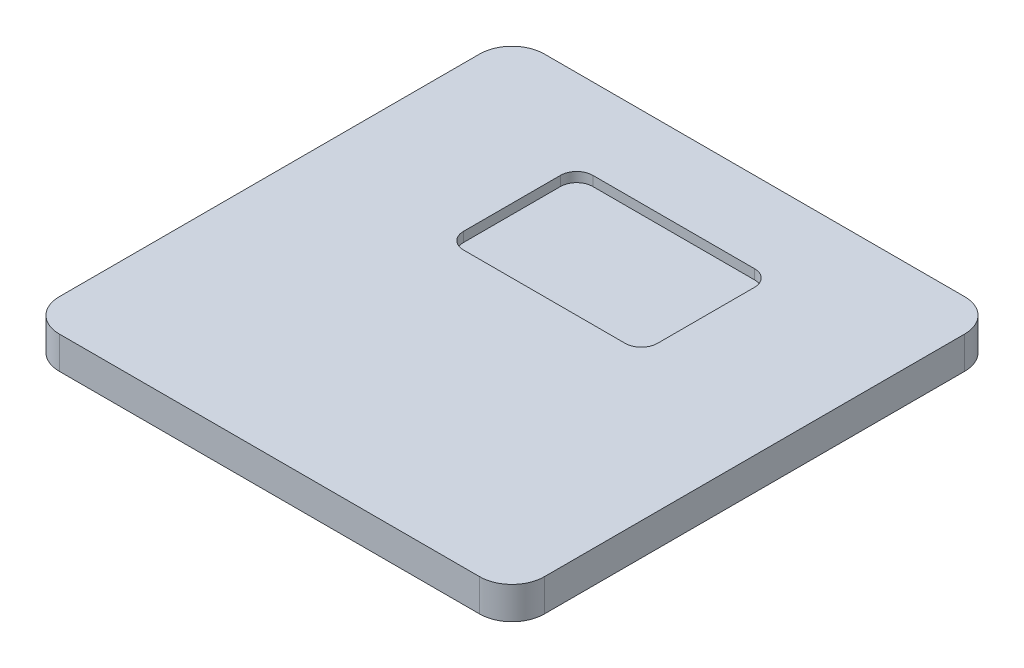
ISO-10303-21;
HEADER;
FILE_DESCRIPTION(('STEP AP214'),'2;1');
FILE_NAME('part.step','',(''),(''),'','','');
FILE_SCHEMA(('AUTOMOTIVE_DESIGN { 1 0 10303 214 1 1 1 1 }'));
ENDSEC;
DATA;
#1=APPLICATION_CONTEXT('core data for automotive mechanical design processes');
#2=APPLICATION_PROTOCOL_DEFINITION('international standard','automotive_design',2000,#1);
#3=PRODUCT_CONTEXT('',#1,'mechanical');
#4=PRODUCT('Part','Part','',(#3));
#5=PRODUCT_RELATED_PRODUCT_CATEGORY('part','',(#4));
#6=PRODUCT_DEFINITION_FORMATION('','',#4);
#7=PRODUCT_DEFINITION_CONTEXT('part definition',#1,'design');
#8=PRODUCT_DEFINITION('design','',#6,#7);
#9=PRODUCT_DEFINITION_SHAPE('','',#8);
#10=(LENGTH_UNIT() NAMED_UNIT(*) SI_UNIT(.MILLI.,.METRE.));
#11=(NAMED_UNIT(*) PLANE_ANGLE_UNIT() SI_UNIT($,.RADIAN.));
#12=(NAMED_UNIT(*) SI_UNIT($,.STERADIAN.) SOLID_ANGLE_UNIT());
#13=UNCERTAINTY_MEASURE_WITH_UNIT(LENGTH_MEASURE(1.E-05),#10,'distance_accuracy_value','');
#14=(GEOMETRIC_REPRESENTATION_CONTEXT(3) GLOBAL_UNCERTAINTY_ASSIGNED_CONTEXT((#13)) GLOBAL_UNIT_ASSIGNED_CONTEXT((#10,
#11,#12)) REPRESENTATION_CONTEXT('',''));
#15=CARTESIAN_POINT('',(0.,0.,0.));
#16=DIRECTION('',(0.,0.,1.));
#17=DIRECTION('',(1.,0.,0.));
#18=AXIS2_PLACEMENT_3D('',#15,#16,#17);
#19=CARTESIAN_POINT('',(25.0000000000001,7.,-15.));
#20=DIRECTION('',(0.,1.,0.));
#21=DIRECTION('',(0.,0.,1.));
#22=AXIS2_PLACEMENT_3D('',#19,#20,#21);
#23=CYLINDRICAL_SURFACE('',#22,5.);
#24=DIRECTION('',(0.,1.,0.));
#25=VECTOR('',#24,1.);
#26=CARTESIAN_POINT('',(30.0000000000001,7.,-15.));
#27=LINE('',#26,#25);
#28=CARTESIAN_POINT('',(30.0000000000001,7.,-15.));
#29=VERTEX_POINT('',#28);
#30=CARTESIAN_POINT('',(30.0000000000001,10.,-15.));
#31=VERTEX_POINT('',#30);
#32=EDGE_CURVE('E281',#29,#31,#27,.T.);
#33=ORIENTED_EDGE('',*,*,#32,.F.);
#34=CARTESIAN_POINT('',(25.0000000000001,7.,-15.));
#35=DIRECTION('',(0.,1.,0.));
#36=DIRECTION('',(0.,0.,1.));
#37=AXIS2_PLACEMENT_3D('',#34,#35,#36);
#38=CIRCLE('',#37,5.);
#39=CARTESIAN_POINT('',(25.0000000000001,7.,-9.99999999999997));
#40=VERTEX_POINT('',#39);
#41=EDGE_CURVE('E51',#40,#29,#38,.T.);
#42=ORIENTED_EDGE('',*,*,#41,.F.);
#43=DIRECTION('',(0.,1.,0.));
#44=VECTOR('',#43,1.);
#45=CARTESIAN_POINT('',(25.0000000000001,7.,-9.99999999999997));
#46=LINE('',#45,#44);
#47=CARTESIAN_POINT('',(25.0000000000001,10.,-9.99999999999997));
#48=VERTEX_POINT('',#47);
#49=EDGE_CURVE('E285',#48,#40,#46,.F.);
#50=ORIENTED_EDGE('',*,*,#49,.F.);
#51=CARTESIAN_POINT('',(25.0000000000001,10.,-15.));
#52=DIRECTION('',(0.,1.,0.));
#53=DIRECTION('',(0.,0.,1.));
#54=AXIS2_PLACEMENT_3D('',#51,#52,#53);
#55=CIRCLE('',#54,5.);
#56=EDGE_CURVE('E11',#48,#31,#55,.T.);
#57=ORIENTED_EDGE('',*,*,#56,.T.);
#58=EDGE_LOOP('',(#33,#42,#50,#57));
#59=FACE_BOUND('',#58,.T.);
#60=ADVANCED_FACE('F43',(#59),#23,.F.);
#61=CARTESIAN_POINT('',(25.,7.,-45.));
#62=DIRECTION('',(0.,-1.,0.));
#63=DIRECTION('',(0.,0.,-1.));
#64=AXIS2_PLACEMENT_3D('',#61,#62,#63);
#65=CYLINDRICAL_SURFACE('',#64,5.);
#66=DIRECTION('',(0.,1.,0.));
#67=VECTOR('',#66,1.);
#68=CARTESIAN_POINT('',(25.,7.,-50.));
#69=LINE('',#68,#67);
#70=CARTESIAN_POINT('',(25.,7.,-50.));
#71=VERTEX_POINT('',#70);
#72=CARTESIAN_POINT('',(25.,10.,-50.));
#73=VERTEX_POINT('',#72);
#74=EDGE_CURVE('E267',#71,#73,#69,.T.);
#75=ORIENTED_EDGE('',*,*,#74,.F.);
#76=CARTESIAN_POINT('',(25.,7.,-45.));
#77=DIRECTION('',(0.,1.,0.));
#78=DIRECTION('',(0.,0.,1.));
#79=AXIS2_PLACEMENT_3D('',#76,#77,#78);
#80=CIRCLE('',#79,5.);
#81=CARTESIAN_POINT('',(30.0000000000001,7.,-45.));
#82=VERTEX_POINT('',#81);
#83=EDGE_CURVE('E275',#82,#71,#80,.T.);
#84=ORIENTED_EDGE('',*,*,#83,.F.);
#85=DIRECTION('',(0.,1.,0.));
#86=VECTOR('',#85,1.);
#87=CARTESIAN_POINT('',(30.0000000000001,7.,-45.));
#88=LINE('',#87,#86);
#89=CARTESIAN_POINT('',(30.0000000000001,10.,-45.));
#90=VERTEX_POINT('',#89);
#91=EDGE_CURVE('E271',#90,#82,#88,.F.);
#92=ORIENTED_EDGE('',*,*,#91,.F.);
#93=CARTESIAN_POINT('',(25.,10.,-45.));
#94=DIRECTION('',(0.,1.,0.));
#95=DIRECTION('',(0.,0.,1.));
#96=AXIS2_PLACEMENT_3D('',#93,#94,#95);
#97=CIRCLE('',#96,5.);
#98=EDGE_CURVE('E278',#90,#73,#97,.T.);
#99=ORIENTED_EDGE('',*,*,#98,.T.);
#100=EDGE_LOOP('',(#75,#84,#92,#99));
#101=FACE_BOUND('',#100,.T.);
#102=ADVANCED_FACE('F373',(#101),#65,.F.);
#103=CARTESIAN_POINT('',(-24.9999999999999,7.,-45.));
#104=DIRECTION('',(0.,1.,0.));
#105=DIRECTION('',(0.,0.,1.));
#106=AXIS2_PLACEMENT_3D('',#103,#104,#105);
#107=CYLINDRICAL_SURFACE('',#106,5.);
#108=DIRECTION('',(0.,1.,0.));
#109=VECTOR('',#108,1.);
#110=CARTESIAN_POINT('',(-29.9999999999999,7.,-45.));
#111=LINE('',#110,#109);
#112=CARTESIAN_POINT('',(-29.9999999999999,7.,-45.));
#113=VERTEX_POINT('',#112);
#114=CARTESIAN_POINT('',(-29.9999999999999,10.,-45.));
#115=VERTEX_POINT('',#114);
#116=EDGE_CURVE('E253',#113,#115,#111,.T.);
#117=ORIENTED_EDGE('',*,*,#116,.F.);
#118=CARTESIAN_POINT('',(-24.9999999999999,7.,-45.));
#119=DIRECTION('',(0.,1.,0.));
#120=DIRECTION('',(0.,0.,1.));
#121=AXIS2_PLACEMENT_3D('',#118,#119,#120);
#122=CIRCLE('',#121,5.);
#123=CARTESIAN_POINT('',(-24.9999999999999,7.,-50.));
#124=VERTEX_POINT('',#123);
#125=EDGE_CURVE('E261',#124,#113,#122,.T.);
#126=ORIENTED_EDGE('',*,*,#125,.F.);
#127=DIRECTION('',(0.,1.,0.));
#128=VECTOR('',#127,1.);
#129=CARTESIAN_POINT('',(-24.9999999999999,7.,-50.));
#130=LINE('',#129,#128);
#131=CARTESIAN_POINT('',(-24.9999999999999,10.,-50.));
#132=VERTEX_POINT('',#131);
#133=EDGE_CURVE('E257',#132,#124,#130,.F.);
#134=ORIENTED_EDGE('',*,*,#133,.F.);
#135=CARTESIAN_POINT('',(-24.9999999999999,10.,-45.));
#136=DIRECTION('',(0.,1.,0.));
#137=DIRECTION('',(0.,0.,1.));
#138=AXIS2_PLACEMENT_3D('',#135,#136,#137);
#139=CIRCLE('',#138,5.);
#140=EDGE_CURVE('E264',#132,#115,#139,.T.);
#141=ORIENTED_EDGE('',*,*,#140,.T.);
#142=EDGE_LOOP('',(#117,#126,#134,#141));
#143=FACE_BOUND('',#142,.T.);
#144=ADVANCED_FACE('F369',(#143),#107,.F.);
#145=CARTESIAN_POINT('',(-24.9999999999999,7.,-15.));
#146=DIRECTION('',(0.,-1.,0.));
#147=DIRECTION('',(0.,0.,-1.));
#148=AXIS2_PLACEMENT_3D('',#145,#146,#147);
#149=CYLINDRICAL_SURFACE('',#148,5.);
#150=DIRECTION('',(0.,1.,0.));
#151=VECTOR('',#150,1.);
#152=CARTESIAN_POINT('',(-24.9999999999999,7.,-9.99999999999997));
#153=LINE('',#152,#151);
#154=CARTESIAN_POINT('',(-24.9999999999999,7.,-9.99999999999997));
#155=VERTEX_POINT('',#154);
#156=CARTESIAN_POINT('',(-24.9999999999999,10.,-9.99999999999997));
#157=VERTEX_POINT('',#156);
#158=EDGE_CURVE('E239',#155,#157,#153,.T.);
#159=ORIENTED_EDGE('',*,*,#158,.F.);
#160=CARTESIAN_POINT('',(-24.9999999999999,7.,-15.));
#161=DIRECTION('',(0.,1.,0.));
#162=DIRECTION('',(0.,0.,1.));
#163=AXIS2_PLACEMENT_3D('',#160,#161,#162);
#164=CIRCLE('',#163,5.);
#165=CARTESIAN_POINT('',(-29.9999999999999,7.,-15.));
#166=VERTEX_POINT('',#165);
#167=EDGE_CURVE('E247',#166,#155,#164,.T.);
#168=ORIENTED_EDGE('',*,*,#167,.F.);
#169=DIRECTION('',(0.,1.,0.));
#170=VECTOR('',#169,1.);
#171=CARTESIAN_POINT('',(-29.9999999999999,7.,-15.));
#172=LINE('',#171,#170);
#173=CARTESIAN_POINT('',(-29.9999999999999,10.,-15.));
#174=VERTEX_POINT('',#173);
#175=EDGE_CURVE('E243',#174,#166,#172,.F.);
#176=ORIENTED_EDGE('',*,*,#175,.F.);
#177=CARTESIAN_POINT('',(-24.9999999999999,10.,-15.));
#178=DIRECTION('',(0.,1.,0.));
#179=DIRECTION('',(0.,0.,1.));
#180=AXIS2_PLACEMENT_3D('',#177,#178,#179);
#181=CIRCLE('',#180,5.);
#182=EDGE_CURVE('E250',#174,#157,#181,.T.);
#183=ORIENTED_EDGE('',*,*,#182,.T.);
#184=EDGE_LOOP('',(#159,#168,#176,#183));
#185=FACE_BOUND('',#184,.T.);
#186=ADVANCED_FACE('F362',(#185),#149,.F.);
#187=CARTESIAN_POINT('',(-64.9999999999999,10.,65.));
#188=DIRECTION('',(0.,1.,0.));
#189=DIRECTION('',(0.,0.,1.));
#190=AXIS2_PLACEMENT_3D('',#187,#188,#189);
#191=CYLINDRICAL_SURFACE('',#190,10.);
#192=DIRECTION('',(0.,1.,0.));
#193=VECTOR('',#192,1.);
#194=CARTESIAN_POINT('',(-74.9999999999999,10.,65.));
#195=LINE('',#194,#193);
#196=CARTESIAN_POINT('',(-74.9999999999999,0.,65.));
#197=VERTEX_POINT('',#196);
#198=CARTESIAN_POINT('',(-74.9999999999999,10.,65.));
#199=VERTEX_POINT('',#198);
#200=EDGE_CURVE('E225',#197,#199,#195,.T.);
#201=ORIENTED_EDGE('',*,*,#200,.F.);
#202=CARTESIAN_POINT('',(-64.9999999999999,0.,65.));
#203=DIRECTION('',(0.,1.,0.));
#204=DIRECTION('',(0.,0.,1.));
#205=AXIS2_PLACEMENT_3D('',#202,#203,#204);
#206=CIRCLE('',#205,10.);
#207=CARTESIAN_POINT('',(-65.,0.,75.));
#208=VERTEX_POINT('',#207);
#209=EDGE_CURVE('E233',#208,#197,#206,.F.);
#210=ORIENTED_EDGE('',*,*,#209,.F.);
#211=DIRECTION('',(0.,1.,0.));
#212=VECTOR('',#211,1.);
#213=CARTESIAN_POINT('',(-65.,10.,75.));
#214=LINE('',#213,#212);
#215=CARTESIAN_POINT('',(-65.,10.,75.));
#216=VERTEX_POINT('',#215);
#217=EDGE_CURVE('E229',#216,#208,#214,.F.);
#218=ORIENTED_EDGE('',*,*,#217,.F.);
#219=CARTESIAN_POINT('',(-64.9999999999999,10.,65.));
#220=DIRECTION('',(0.,1.,0.));
#221=DIRECTION('',(0.,0.,1.));
#222=AXIS2_PLACEMENT_3D('',#219,#220,#221);
#223=CIRCLE('',#222,10.);
#224=EDGE_CURVE('E236',#199,#216,#223,.T.);
#225=ORIENTED_EDGE('',*,*,#224,.F.);
#226=EDGE_LOOP('',(#201,#210,#218,#225));
#227=FACE_BOUND('',#226,.T.);
#228=ADVANCED_FACE('F360',(#227),#191,.T.);
#229=CARTESIAN_POINT('',(-65.,10.,-65.));
#230=DIRECTION('',(0.,-1.,0.));
#231=DIRECTION('',(0.,0.,-1.));
#232=AXIS2_PLACEMENT_3D('',#229,#230,#231);
#233=CYLINDRICAL_SURFACE('',#232,10.);
#234=DIRECTION('',(0.,1.,0.));
#235=VECTOR('',#234,1.);
#236=CARTESIAN_POINT('',(-65.,10.,-75.));
#237=LINE('',#236,#235);
#238=CARTESIAN_POINT('',(-65.,0.,-75.));
#239=VERTEX_POINT('',#238);
#240=CARTESIAN_POINT('',(-65.,10.,-75.));
#241=VERTEX_POINT('',#240);
#242=EDGE_CURVE('E210',#239,#241,#237,.T.);
#243=ORIENTED_EDGE('',*,*,#242,.F.);
#244=CARTESIAN_POINT('',(-65.,0.,-65.));
#245=DIRECTION('',(0.,1.,0.));
#246=DIRECTION('',(0.,0.,1.));
#247=AXIS2_PLACEMENT_3D('',#244,#245,#246);
#248=CIRCLE('',#247,10.);
#249=CARTESIAN_POINT('',(-74.9999999999999,0.,-65.));
#250=VERTEX_POINT('',#249);
#251=EDGE_CURVE('E218',#250,#239,#248,.F.);
#252=ORIENTED_EDGE('',*,*,#251,.F.);
#253=DIRECTION('',(0.,1.,0.));
#254=VECTOR('',#253,1.);
#255=CARTESIAN_POINT('',(-74.9999999999999,10.,-65.));
#256=LINE('',#255,#254);
#257=CARTESIAN_POINT('',(-74.9999999999999,10.,-65.));
#258=VERTEX_POINT('',#257);
#259=EDGE_CURVE('E214',#258,#250,#256,.F.);
#260=ORIENTED_EDGE('',*,*,#259,.F.);
#261=CARTESIAN_POINT('',(-65.,10.,-65.));
#262=DIRECTION('',(0.,1.,0.));
#263=DIRECTION('',(0.,0.,1.));
#264=AXIS2_PLACEMENT_3D('',#261,#262,#263);
#265=CIRCLE('',#264,10.);
#266=EDGE_CURVE('E221',#241,#258,#265,.T.);
#267=ORIENTED_EDGE('',*,*,#266,.F.);
#268=EDGE_LOOP('',(#243,#252,#260,#267));
#269=FACE_BOUND('',#268,.T.);
#270=ADVANCED_FACE('F344',(#269),#233,.T.);
#271=CARTESIAN_POINT('',(65.0000000000001,10.,-65.));
#272=DIRECTION('',(0.,1.,0.));
#273=DIRECTION('',(0.,0.,1.));
#274=AXIS2_PLACEMENT_3D('',#271,#272,#273);
#275=CYLINDRICAL_SURFACE('',#274,10.);
#276=DIRECTION('',(0.,1.,0.));
#277=VECTOR('',#276,1.);
#278=CARTESIAN_POINT('',(75.0000000000001,10.,-65.));
#279=LINE('',#278,#277);
#280=CARTESIAN_POINT('',(75.0000000000001,0.,-64.9999999999999));
#281=VERTEX_POINT('',#280);
#282=CARTESIAN_POINT('',(75.0000000000001,10.,-64.9999999999999));
#283=VERTEX_POINT('',#282);
#284=EDGE_CURVE('E166',#281,#283,#279,.T.);
#285=ORIENTED_EDGE('',*,*,#284,.F.);
#286=CARTESIAN_POINT('',(65.0000000000001,0.,-65.));
#287=DIRECTION('',(0.,1.,0.));
#288=DIRECTION('',(0.,0.,1.));
#289=AXIS2_PLACEMENT_3D('',#286,#287,#288);
#290=CIRCLE('',#289,10.);
#291=CARTESIAN_POINT('',(65.,0.,-75.));
#292=VERTEX_POINT('',#291);
#293=EDGE_CURVE('E180',#292,#281,#290,.F.);
#294=ORIENTED_EDGE('',*,*,#293,.F.);
#295=DIRECTION('',(0.,1.,0.));
#296=VECTOR('',#295,1.);
#297=CARTESIAN_POINT('',(65.0000000000001,10.,-75.));
#298=LINE('',#297,#296);
#299=CARTESIAN_POINT('',(65.,10.,-75.));
#300=VERTEX_POINT('',#299);
#301=EDGE_CURVE('E201',#300,#292,#298,.F.);
#302=ORIENTED_EDGE('',*,*,#301,.F.);
#303=CARTESIAN_POINT('',(65.0000000000001,10.,-65.));
#304=DIRECTION('',(0.,1.,0.));
#305=DIRECTION('',(0.,0.,1.));
#306=AXIS2_PLACEMENT_3D('',#303,#304,#305);
#307=CIRCLE('',#306,10.);
#308=EDGE_CURVE('E207',#283,#300,#307,.T.);
#309=ORIENTED_EDGE('',*,*,#308,.F.);
#310=EDGE_LOOP('',(#285,#294,#302,#309));
#311=FACE_BOUND('',#310,.T.);
#312=ADVANCED_FACE('F354',(#311),#275,.T.);
#313=CARTESIAN_POINT('',(65.0000000000001,10.,65.));
#314=DIRECTION('',(0.,1.,0.));
#315=DIRECTION('',(0.,0.,1.));
#316=AXIS2_PLACEMENT_3D('',#313,#314,#315);
#317=CYLINDRICAL_SURFACE('',#316,10.);
#318=DIRECTION('',(0.,-1.,0.));
#319=VECTOR('',#318,1.);
#320=CARTESIAN_POINT('',(75.0000000000001,10.,65.));
#321=LINE('',#320,#319);
#322=CARTESIAN_POINT('',(75.0000000000001,10.,65.));
#323=VERTEX_POINT('',#322);
#324=CARTESIAN_POINT('',(75.0000000000001,0.,65.));
#325=VERTEX_POINT('',#324);
#326=EDGE_CURVE('E157',#323,#325,#321,.T.);
#327=ORIENTED_EDGE('',*,*,#326,.F.);
#328=CARTESIAN_POINT('',(65.0000000000001,10.,65.));
#329=DIRECTION('',(0.,1.,0.));
#330=DIRECTION('',(0.,0.,1.));
#331=AXIS2_PLACEMENT_3D('',#328,#329,#330);
#332=CIRCLE('',#331,10.);
#333=CARTESIAN_POINT('',(65.,10.,75.));
#334=VERTEX_POINT('',#333);
#335=EDGE_CURVE('E167',#334,#323,#332,.T.);
#336=ORIENTED_EDGE('',*,*,#335,.F.);
#337=DIRECTION('',(0.,-1.,0.));
#338=VECTOR('',#337,1.);
#339=CARTESIAN_POINT('',(65.0000000000001,10.,75.));
#340=LINE('',#339,#338);
#341=CARTESIAN_POINT('',(65.,0.,75.));
#342=VERTEX_POINT('',#341);
#343=EDGE_CURVE('E160',#342,#334,#340,.F.);
#344=ORIENTED_EDGE('',*,*,#343,.F.);
#345=CARTESIAN_POINT('',(65.0000000000001,0.,65.));
#346=DIRECTION('',(0.,1.,0.));
#347=DIRECTION('',(0.,0.,1.));
#348=AXIS2_PLACEMENT_3D('',#345,#346,#347);
#349=CIRCLE('',#348,10.);
#350=EDGE_CURVE('E154',#325,#342,#349,.F.);
#351=ORIENTED_EDGE('',*,*,#350,.F.);
#352=EDGE_LOOP('',(#327,#336,#344,#351));
#353=FACE_BOUND('',#352,.T.);
#354=ADVANCED_FACE('F156',(#353),#317,.T.);
#355=CARTESIAN_POINT('',(70.,10.,-75.));
#356=DIRECTION('',(0.,0.,1.));
#357=DIRECTION('',(1.,0.,0.));
#358=AXIS2_PLACEMENT_3D('',#355,#356,#357);
#359=PLANE('',#358);
#360=DIRECTION('',(-1.,0.,0.));
#361=VECTOR('',#360,1.);
#362=CARTESIAN_POINT('',(70.,0.,-75.));
#363=LINE('',#362,#361);
#364=EDGE_CURVE('E306',#292,#239,#363,.T.);
#365=ORIENTED_EDGE('',*,*,#364,.T.);
#366=ORIENTED_EDGE('',*,*,#242,.T.);
#367=DIRECTION('',(-1.,0.,0.));
#368=VECTOR('',#367,1.);
#369=CARTESIAN_POINT('',(70.,10.,-75.));
#370=LINE('',#369,#368);
#371=EDGE_CURVE('E183',#300,#241,#370,.T.);
#372=ORIENTED_EDGE('',*,*,#371,.F.);
#373=ORIENTED_EDGE('',*,*,#301,.T.);
#374=EDGE_LOOP('',(#365,#366,#372,#373));
#375=FACE_BOUND('',#374,.T.);
#376=ADVANCED_FACE('F351',(#375),#359,.F.);
#377=CARTESIAN_POINT('',(-74.9999999999999,10.,70.));
#378=DIRECTION('',(-1.,0.,0.));
#379=DIRECTION('',(0.,0.,1.));
#380=AXIS2_PLACEMENT_3D('',#377,#378,#379);
#381=PLANE('',#380);
#382=DIRECTION('',(0.,0.,-1.));
#383=VECTOR('',#382,1.);
#384=CARTESIAN_POINT('',(-74.9999999999999,0.,70.));
#385=LINE('',#384,#383);
#386=EDGE_CURVE('E191',#197,#250,#385,.T.);
#387=ORIENTED_EDGE('',*,*,#386,.F.);
#388=ORIENTED_EDGE('',*,*,#200,.T.);
#389=DIRECTION('',(0.,0.,-1.));
#390=VECTOR('',#389,1.);
#391=CARTESIAN_POINT('',(-74.9999999999999,10.,70.));
#392=LINE('',#391,#390);
#393=EDGE_CURVE('E189',#199,#258,#392,.T.);
#394=ORIENTED_EDGE('',*,*,#393,.T.);
#395=ORIENTED_EDGE('',*,*,#259,.T.);
#396=EDGE_LOOP('',(#387,#388,#394,#395));
#397=FACE_BOUND('',#396,.T.);
#398=ADVANCED_FACE('F345',(#397),#381,.T.);
#399=CARTESIAN_POINT('',(70.,10.,75.));
#400=DIRECTION('',(0.,0.,1.));
#401=DIRECTION('',(1.,0.,0.));
#402=AXIS2_PLACEMENT_3D('',#399,#400,#401);
#403=PLANE('',#402);
#404=DIRECTION('',(-1.,0.,0.));
#405=VECTOR('',#404,1.);
#406=CARTESIAN_POINT('',(70.,10.,75.));
#407=LINE('',#406,#405);
#408=EDGE_CURVE('E328',#334,#216,#407,.T.);
#409=ORIENTED_EDGE('',*,*,#408,.T.);
#410=ORIENTED_EDGE('',*,*,#217,.T.);
#411=DIRECTION('',(-1.,0.,0.));
#412=VECTOR('',#411,1.);
#413=CARTESIAN_POINT('',(70.,0.,75.));
#414=LINE('',#413,#412);
#415=EDGE_CURVE('E184',#342,#208,#414,.T.);
#416=ORIENTED_EDGE('',*,*,#415,.F.);
#417=ORIENTED_EDGE('',*,*,#343,.T.);
#418=EDGE_LOOP('',(#409,#410,#416,#417));
#419=FACE_BOUND('',#418,.T.);
#420=ADVANCED_FACE('F357',(#419),#403,.T.);
#421=CARTESIAN_POINT('',(75.0000000000001,10.,70.));
#422=DIRECTION('',(-1.,0.,0.));
#423=DIRECTION('',(0.,0.,1.));
#424=AXIS2_PLACEMENT_3D('',#421,#422,#423);
#425=PLANE('',#424);
#426=DIRECTION('',(0.,0.,-1.));
#427=VECTOR('',#426,1.);
#428=CARTESIAN_POINT('',(75.0000000000001,0.,70.));
#429=LINE('',#428,#427);
#430=EDGE_CURVE('E173',#325,#281,#429,.T.);
#431=ORIENTED_EDGE('',*,*,#430,.T.);
#432=ORIENTED_EDGE('',*,*,#284,.T.);
#433=DIRECTION('',(0.,0.,-1.));
#434=VECTOR('',#433,1.);
#435=CARTESIAN_POINT('',(75.0000000000001,10.,70.));
#436=LINE('',#435,#434);
#437=EDGE_CURVE('E175',#323,#283,#436,.T.);
#438=ORIENTED_EDGE('',*,*,#437,.F.);
#439=ORIENTED_EDGE('',*,*,#326,.T.);
#440=EDGE_LOOP('',(#431,#432,#438,#439));
#441=FACE_BOUND('',#440,.T.);
#442=ADVANCED_FACE('F171',(#441),#425,.F.);
#443=CARTESIAN_POINT('',(70.,10.,-70.));
#444=DIRECTION('',(0.,1.,0.));
#445=DIRECTION('',(0.,0.,1.));
#446=AXIS2_PLACEMENT_3D('',#443,#444,#445);
#447=PLANE('',#446);
#448=ORIENTED_EDGE('',*,*,#98,.F.);
#449=DIRECTION('',(0.,0.,1.));
#450=VECTOR('',#449,1.);
#451=CARTESIAN_POINT('',(30.0000000000001,10.,-50.));
#452=LINE('',#451,#450);
#453=EDGE_CURVE('E319',#90,#31,#452,.T.);
#454=ORIENTED_EDGE('',*,*,#453,.T.);
#455=ORIENTED_EDGE('',*,*,#56,.F.);
#456=DIRECTION('',(1.,0.,0.));
#457=VECTOR('',#456,1.);
#458=CARTESIAN_POINT('',(-29.9999999999999,10.,-9.99999999999997));
#459=LINE('',#458,#457);
#460=EDGE_CURVE('E315',#157,#48,#459,.T.);
#461=ORIENTED_EDGE('',*,*,#460,.F.);
#462=ORIENTED_EDGE('',*,*,#182,.F.);
#463=DIRECTION('',(0.,0.,1.));
#464=VECTOR('',#463,1.);
#465=CARTESIAN_POINT('',(-29.9999999999999,10.,-50.));
#466=LINE('',#465,#464);
#467=EDGE_CURVE('E312',#115,#174,#466,.T.);
#468=ORIENTED_EDGE('',*,*,#467,.F.);
#469=ORIENTED_EDGE('',*,*,#140,.F.);
#470=DIRECTION('',(1.,0.,0.));
#471=VECTOR('',#470,1.);
#472=CARTESIAN_POINT('',(-29.9999999999999,10.,-50.));
#473=LINE('',#472,#471);
#474=EDGE_CURVE('E322',#132,#73,#473,.T.);
#475=ORIENTED_EDGE('',*,*,#474,.T.);
#476=EDGE_LOOP('',(#448,#454,#455,#461,#462,#468,#469,#475));
#477=FACE_BOUND('',#476,.T.);
#478=ORIENTED_EDGE('',*,*,#393,.F.);
#479=ORIENTED_EDGE('',*,*,#224,.T.);
#480=ORIENTED_EDGE('',*,*,#408,.F.);
#481=ORIENTED_EDGE('',*,*,#335,.T.);
#482=ORIENTED_EDGE('',*,*,#437,.T.);
#483=ORIENTED_EDGE('',*,*,#308,.T.);
#484=ORIENTED_EDGE('',*,*,#371,.T.);
#485=ORIENTED_EDGE('',*,*,#266,.T.);
#486=EDGE_LOOP('',(#478,#479,#480,#481,#482,#483,#484,#485));
#487=FACE_BOUND('',#486,.T.);
#488=ADVANCED_FACE('F348',(#477,#487),#447,.T.);
#489=CARTESIAN_POINT('',(70.,0.,-70.));
#490=DIRECTION('',(0.,1.,0.));
#491=DIRECTION('',(0.,0.,1.));
#492=AXIS2_PLACEMENT_3D('',#489,#490,#491);
#493=PLANE('',#492);
#494=ORIENTED_EDGE('',*,*,#415,.T.);
#495=ORIENTED_EDGE('',*,*,#209,.T.);
#496=ORIENTED_EDGE('',*,*,#386,.T.);
#497=ORIENTED_EDGE('',*,*,#251,.T.);
#498=ORIENTED_EDGE('',*,*,#364,.F.);
#499=ORIENTED_EDGE('',*,*,#293,.T.);
#500=ORIENTED_EDGE('',*,*,#430,.F.);
#501=ORIENTED_EDGE('',*,*,#350,.T.);
#502=EDGE_LOOP('',(#494,#495,#496,#497,#498,#499,#500,#501));
#503=FACE_BOUND('',#502,.T.);
#504=ADVANCED_FACE('F178',(#503),#493,.F.);
#505=CARTESIAN_POINT('',(-29.9999999999999,7.,-50.));
#506=DIRECTION('',(-1.,0.,0.));
#507=DIRECTION('',(0.,0.,1.));
#508=AXIS2_PLACEMENT_3D('',#505,#506,#507);
#509=PLANE('',#508);
#510=DIRECTION('',(0.,0.,1.));
#511=VECTOR('',#510,1.);
#512=CARTESIAN_POINT('',(-29.9999999999999,7.,-50.));
#513=LINE('',#512,#511);
#514=EDGE_CURVE('E308',#113,#166,#513,.T.);
#515=ORIENTED_EDGE('',*,*,#514,.F.);
#516=ORIENTED_EDGE('',*,*,#116,.T.);
#517=ORIENTED_EDGE('',*,*,#467,.T.);
#518=ORIENTED_EDGE('',*,*,#175,.T.);
#519=EDGE_LOOP('',(#515,#516,#517,#518));
#520=FACE_BOUND('',#519,.T.);
#521=ADVANCED_FACE('F394',(#520),#509,.F.);
#522=CARTESIAN_POINT('',(-29.9999999999999,7.,-50.));
#523=DIRECTION('',(0.,0.,1.));
#524=DIRECTION('',(1.,0.,0.));
#525=AXIS2_PLACEMENT_3D('',#522,#523,#524);
#526=PLANE('',#525);
#527=DIRECTION('',(1.,0.,0.));
#528=VECTOR('',#527,1.);
#529=CARTESIAN_POINT('',(-29.9999999999999,7.,-50.));
#530=LINE('',#529,#528);
#531=EDGE_CURVE('E301',#124,#71,#530,.T.);
#532=ORIENTED_EDGE('',*,*,#531,.T.);
#533=ORIENTED_EDGE('',*,*,#74,.T.);
#534=ORIENTED_EDGE('',*,*,#474,.F.);
#535=ORIENTED_EDGE('',*,*,#133,.T.);
#536=EDGE_LOOP('',(#532,#533,#534,#535));
#537=FACE_BOUND('',#536,.T.);
#538=ADVANCED_FACE('F387',(#537),#526,.T.);
#539=CARTESIAN_POINT('',(30.0000000000001,7.,-50.));
#540=DIRECTION('',(-1.,0.,0.));
#541=DIRECTION('',(0.,0.,1.));
#542=AXIS2_PLACEMENT_3D('',#539,#540,#541);
#543=PLANE('',#542);
#544=DIRECTION('',(0.,0.,1.));
#545=VECTOR('',#544,1.);
#546=CARTESIAN_POINT('',(30.0000000000001,7.,-50.));
#547=LINE('',#546,#545);
#548=EDGE_CURVE('E293',#82,#29,#547,.T.);
#549=ORIENTED_EDGE('',*,*,#548,.T.);
#550=ORIENTED_EDGE('',*,*,#32,.T.);
#551=ORIENTED_EDGE('',*,*,#453,.F.);
#552=ORIENTED_EDGE('',*,*,#91,.T.);
#553=EDGE_LOOP('',(#549,#550,#551,#552));
#554=FACE_BOUND('',#553,.T.);
#555=ADVANCED_FACE('F298',(#554),#543,.T.);
#556=CARTESIAN_POINT('',(-29.9999999999999,7.,-9.99999999999997));
#557=DIRECTION('',(0.,0.,1.));
#558=DIRECTION('',(1.,0.,0.));
#559=AXIS2_PLACEMENT_3D('',#556,#557,#558);
#560=PLANE('',#559);
#561=ORIENTED_EDGE('',*,*,#460,.T.);
#562=ORIENTED_EDGE('',*,*,#49,.T.);
#563=DIRECTION('',(1.,0.,0.));
#564=VECTOR('',#563,1.);
#565=CARTESIAN_POINT('',(-29.9999999999999,7.,-9.99999999999997));
#566=LINE('',#565,#564);
#567=EDGE_CURVE('E295',#155,#40,#566,.T.);
#568=ORIENTED_EDGE('',*,*,#567,.F.);
#569=ORIENTED_EDGE('',*,*,#158,.T.);
#570=EDGE_LOOP('',(#561,#562,#568,#569));
#571=FACE_BOUND('',#570,.T.);
#572=ADVANCED_FACE('F400',(#571),#560,.F.);
#573=CARTESIAN_POINT('',(0.,7.,0.));
#574=DIRECTION('',(0.,1.,0.));
#575=DIRECTION('',(0.,0.,1.));
#576=AXIS2_PLACEMENT_3D('',#573,#574,#575);
#577=PLANE('',#576);
#578=ORIENTED_EDGE('',*,*,#567,.T.);
#579=ORIENTED_EDGE('',*,*,#41,.T.);
#580=ORIENTED_EDGE('',*,*,#548,.F.);
#581=ORIENTED_EDGE('',*,*,#83,.T.);
#582=ORIENTED_EDGE('',*,*,#531,.F.);
#583=ORIENTED_EDGE('',*,*,#125,.T.);
#584=ORIENTED_EDGE('',*,*,#514,.T.);
#585=ORIENTED_EDGE('',*,*,#167,.T.);
#586=EDGE_LOOP('',(#578,#579,#580,#581,#582,#583,#584,#585));
#587=FACE_BOUND('',#586,.T.);
#588=ADVANCED_FACE('F291',(#587),#577,.T.);
#589=CLOSED_SHELL('',(#60,#102,#144,#186,#228,#270,#312,#354,#376,#398,#420,#442,#488,#504,#521,
#538,#555,#572,#588));
#590=MANIFOLD_SOLID_BREP('B2',#589);
#591=ADVANCED_BREP_SHAPE_REPRESENTATION('',(#18,#590),#14);
#592=SHAPE_DEFINITION_REPRESENTATION(#9,#591);
ENDSEC;
END-ISO-10303-21;
